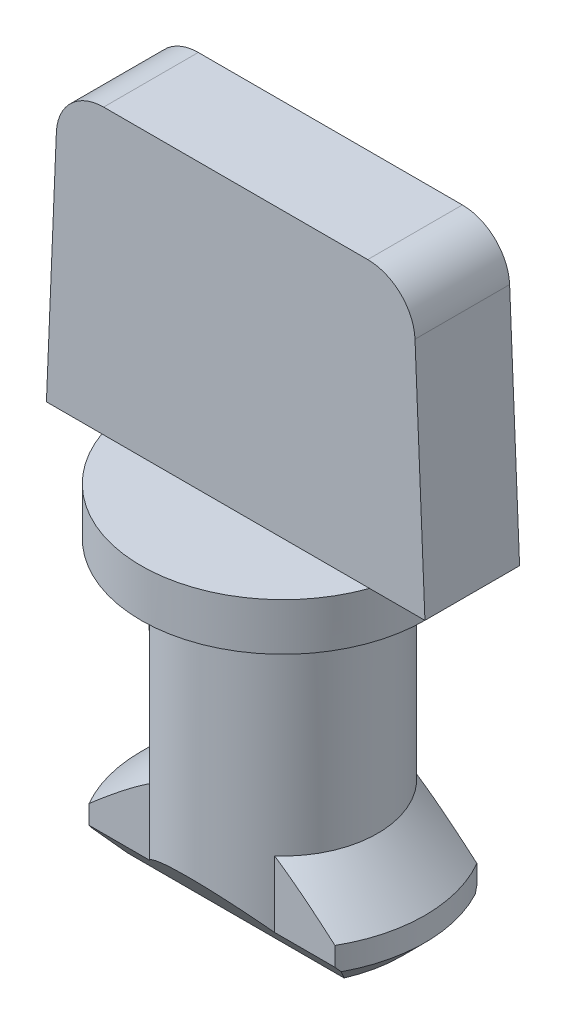
ISO-10303-21;
HEADER;
FILE_DESCRIPTION(('STEP AP214'),'2;1');
FILE_NAME('part.step','',(''),(''),'','','');
FILE_SCHEMA(('AUTOMOTIVE_DESIGN { 1 0 10303 214 1 1 1 1 }'));
ENDSEC;
DATA;
#1=APPLICATION_CONTEXT('core data for automotive mechanical design processes');
#2=APPLICATION_PROTOCOL_DEFINITION('international standard','automotive_design',2000,#1);
#3=PRODUCT_CONTEXT('',#1,'mechanical');
#4=PRODUCT('Part','Part','',(#3));
#5=PRODUCT_RELATED_PRODUCT_CATEGORY('part','',(#4));
#6=PRODUCT_DEFINITION_FORMATION('','',#4);
#7=PRODUCT_DEFINITION_CONTEXT('part definition',#1,'design');
#8=PRODUCT_DEFINITION('design','',#6,#7);
#9=PRODUCT_DEFINITION_SHAPE('','',#8);
#10=(LENGTH_UNIT() NAMED_UNIT(*) SI_UNIT(.MILLI.,.METRE.));
#11=(NAMED_UNIT(*) PLANE_ANGLE_UNIT() SI_UNIT($,.RADIAN.));
#12=(NAMED_UNIT(*) SI_UNIT($,.STERADIAN.) SOLID_ANGLE_UNIT());
#13=UNCERTAINTY_MEASURE_WITH_UNIT(LENGTH_MEASURE(1.E-05),#10,'distance_accuracy_value','');
#14=(GEOMETRIC_REPRESENTATION_CONTEXT(3) GLOBAL_UNCERTAINTY_ASSIGNED_CONTEXT((#13)) GLOBAL_UNIT_ASSIGNED_CONTEXT((#10,
#11,#12)) REPRESENTATION_CONTEXT('',''));
#15=CARTESIAN_POINT('',(0.,0.,0.));
#16=DIRECTION('',(0.,0.,1.));
#17=DIRECTION('',(1.,0.,0.));
#18=AXIS2_PLACEMENT_3D('',#15,#16,#17);
#19=CARTESIAN_POINT('',(0.,-6.4,0.));
#20=DIRECTION('',(0.,1.,0.));
#21=DIRECTION('',(0.,0.,1.));
#22=AXIS2_PLACEMENT_3D('',#19,#20,#21);
#23=CYLINDRICAL_SURFACE('',#22,2.);
#24=CARTESIAN_POINT('',(0.,0.,0.));
#25=DIRECTION('',(0.,1.,0.));
#26=DIRECTION('',(0.,0.,1.));
#27=AXIS2_PLACEMENT_3D('',#24,#25,#26);
#28=CIRCLE('',#27,2.);
#29=CARTESIAN_POINT('',(0.,0.,2.));
#30=VERTEX_POINT('',#29);
#31=EDGE_CURVE('E407',#30,#30,#28,.F.);
#32=ORIENTED_EDGE('',*,*,#31,.T.);
#33=EDGE_LOOP('',(#32));
#34=FACE_BOUND('',#33,.T.);
#35=CARTESIAN_POINT('',(0.,-7.6,0.));
#36=DIRECTION('',(0.,-0.640184399664479,-0.768221279597376));
#37=DIRECTION('',(0.,0.768221279597376,-0.640184399664479));
#38=AXIS2_PLACEMENT_3D('',#35,#36,#37);
#39=ELLIPSE('',#38,3.12409987036266,2.);
#40=CARTESIAN_POINT('',(1.32287565553229,-5.8,-1.5));
#41=VERTEX_POINT('',#40);
#42=CARTESIAN_POINT('',(-1.32287565553229,-5.8,-1.5));
#43=VERTEX_POINT('',#42);
#44=EDGE_CURVE('E54',#41,#43,#39,.F.);
#45=ORIENTED_EDGE('',*,*,#44,.T.);
#46=DIRECTION('',(0.,1.,0.));
#47=VECTOR('',#46,1.);
#48=CARTESIAN_POINT('',(-1.32287565553229,-6.4,-1.5));
#49=LINE('',#48,#47);
#50=CARTESIAN_POINT('',(-1.32287565553229,-4.4,-1.5));
#51=VERTEX_POINT('',#50);
#52=EDGE_CURVE('E344',#43,#51,#49,.T.);
#53=ORIENTED_EDGE('',*,*,#52,.T.);
#54=CARTESIAN_POINT('',(0.,-4.4,0.));
#55=DIRECTION('',(0.,-1.,0.));
#56=DIRECTION('',(0.,0.,-1.));
#57=AXIS2_PLACEMENT_3D('',#54,#55,#56);
#58=CIRCLE('',#57,2.);
#59=CARTESIAN_POINT('',(-1.3228756555323,-4.4,1.5));
#60=VERTEX_POINT('',#59);
#61=EDGE_CURVE('E204',#60,#51,#58,.T.);
#62=ORIENTED_EDGE('',*,*,#61,.F.);
#63=DIRECTION('',(0.,1.,0.));
#64=VECTOR('',#63,1.);
#65=CARTESIAN_POINT('',(-1.3228756555323,-6.4,1.5));
#66=LINE('',#65,#64);
#67=CARTESIAN_POINT('',(-1.3228756555323,-5.8,1.5));
#68=VERTEX_POINT('',#67);
#69=EDGE_CURVE('E346',#60,#68,#66,.F.);
#70=ORIENTED_EDGE('',*,*,#69,.T.);
#71=CARTESIAN_POINT('',(0.,-7.6,0.));
#72=DIRECTION('',(0.,-0.640184399664479,0.768221279597376));
#73=DIRECTION('',(0.,0.768221279597376,0.640184399664479));
#74=AXIS2_PLACEMENT_3D('',#71,#72,#73);
#75=ELLIPSE('',#74,3.12409987036266,2.);
#76=CARTESIAN_POINT('',(1.3228756555323,-5.8,1.5));
#77=VERTEX_POINT('',#76);
#78=EDGE_CURVE('E457',#68,#77,#75,.F.);
#79=ORIENTED_EDGE('',*,*,#78,.T.);
#80=DIRECTION('',(0.,1.,0.));
#81=VECTOR('',#80,1.);
#82=CARTESIAN_POINT('',(1.3228756555323,-6.4,1.5));
#83=LINE('',#82,#81);
#84=CARTESIAN_POINT('',(1.3228756555323,-4.4,1.5));
#85=VERTEX_POINT('',#84);
#86=EDGE_CURVE('E332',#77,#85,#83,.T.);
#87=ORIENTED_EDGE('',*,*,#86,.T.);
#88=CARTESIAN_POINT('',(1.32287565553229,-4.4,-1.5));
#89=VERTEX_POINT('',#88);
#90=EDGE_CURVE('E199',#89,#85,#58,.T.);
#91=ORIENTED_EDGE('',*,*,#90,.F.);
#92=DIRECTION('',(0.,1.,0.));
#93=VECTOR('',#92,1.);
#94=CARTESIAN_POINT('',(1.32287565553229,-6.4,-1.5));
#95=LINE('',#94,#93);
#96=EDGE_CURVE('E319',#89,#41,#95,.F.);
#97=ORIENTED_EDGE('',*,*,#96,.T.);
#98=EDGE_LOOP('',(#45,#53,#62,#70,#79,#87,#91,#97));
#99=FACE_BOUND('',#98,.T.);
#100=ADVANCED_FACE('F34',(#34,#99),#23,.T.);
#101=CARTESIAN_POINT('',(0.,-6.4,0.));
#102=DIRECTION('',(0.,-1.,0.));
#103=DIRECTION('',(0.,0.,-1.));
#104=AXIS2_PLACEMENT_3D('',#101,#102,#103);
#105=PLANE('',#104);
#106=CARTESIAN_POINT('',(0.,-6.4,0.));
#107=DIRECTION('',(0.,-1.,0.));
#108=DIRECTION('',(0.,0.,-1.));
#109=AXIS2_PLACEMENT_3D('',#106,#107,#108);
#110=CIRCLE('',#109,2.5);
#111=CARTESIAN_POINT('',(-2.29128784747792,-6.4,1.));
#112=VERTEX_POINT('',#111);
#113=CARTESIAN_POINT('',(-2.29128784747792,-6.4,-1.));
#114=VERTEX_POINT('',#113);
#115=EDGE_CURVE('E191',#112,#114,#110,.T.);
#116=ORIENTED_EDGE('',*,*,#115,.T.);
#117=DIRECTION('',(-1.,0.,0.));
#118=VECTOR('',#117,1.);
#119=CARTESIAN_POINT('',(4.001,-6.4,-1.));
#120=LINE('',#119,#118);
#121=CARTESIAN_POINT('',(2.29128784747792,-6.4,-1.));
#122=VERTEX_POINT('',#121);
#123=EDGE_CURVE('E175',#122,#114,#120,.T.);
#124=ORIENTED_EDGE('',*,*,#123,.F.);
#125=CARTESIAN_POINT('',(0.,-6.4,0.));
#126=DIRECTION('',(0.,-1.,0.));
#127=DIRECTION('',(0.,0.,-1.));
#128=AXIS2_PLACEMENT_3D('',#125,#126,#127);
#129=CIRCLE('',#128,2.5);
#130=CARTESIAN_POINT('',(2.29128784747792,-6.4,1.));
#131=VERTEX_POINT('',#130);
#132=EDGE_CURVE('E198',#122,#131,#129,.T.);
#133=ORIENTED_EDGE('',*,*,#132,.T.);
#134=DIRECTION('',(-1.,0.,0.));
#135=VECTOR('',#134,1.);
#136=CARTESIAN_POINT('',(4.001,-6.4,1.));
#137=LINE('',#136,#135);
#138=EDGE_CURVE('E197',#131,#112,#137,.T.);
#139=ORIENTED_EDGE('',*,*,#138,.T.);
#140=EDGE_LOOP('',(#116,#124,#133,#139));
#141=FACE_BOUND('',#140,.T.);
#142=ADVANCED_FACE('F195',(#141),#105,.T.);
#143=CARTESIAN_POINT('',(0.,-4.4,0.));
#144=DIRECTION('',(0.,-1.,0.));
#145=DIRECTION('',(0.,0.,-1.));
#146=AXIS2_PLACEMENT_3D('',#143,#144,#145);
#147=CYLINDRICAL_SURFACE('',#146,3.);
#148=DIRECTION('',(0.,-1.,0.));
#149=VECTOR('',#148,1.);
#150=CARTESIAN_POINT('',(-2.59807621135331,-4.4,-1.5));
#151=LINE('',#150,#149);
#152=CARTESIAN_POINT('',(-2.59807621135331,-5.4,-1.5));
#153=VERTEX_POINT('',#152);
#154=CARTESIAN_POINT('',(-2.59807621135331,-5.8,-1.5));
#155=VERTEX_POINT('',#154);
#156=EDGE_CURVE('E327',#153,#155,#151,.T.);
#157=ORIENTED_EDGE('',*,*,#156,.T.);
#158=CARTESIAN_POINT('',(0.,-7.6,0.));
#159=DIRECTION('',(0.,0.640184399664479,0.768221279597376));
#160=DIRECTION('',(0.,-0.768221279597376,0.640184399664479));
#161=AXIS2_PLACEMENT_3D('',#158,#159,#160);
#162=ELLIPSE('',#161,4.68614980554399,3.);
#163=CARTESIAN_POINT('',(-2.6444386087704,-5.9,-1.41666666666667));
#164=VERTEX_POINT('',#163);
#165=EDGE_CURVE('E192',#155,#164,#162,.T.);
#166=ORIENTED_EDGE('',*,*,#165,.T.);
#167=CARTESIAN_POINT('',(0.,-5.9,0.));
#168=DIRECTION('',(0.,-1.,0.));
#169=DIRECTION('',(0.,0.,-1.));
#170=AXIS2_PLACEMENT_3D('',#167,#168,#169);
#171=CIRCLE('',#170,3.);
#172=CARTESIAN_POINT('',(-2.6444386087704,-5.9,1.41666666666667));
#173=VERTEX_POINT('',#172);
#174=EDGE_CURVE('E62',#164,#173,#171,.F.);
#175=ORIENTED_EDGE('',*,*,#174,.T.);
#176=CARTESIAN_POINT('',(0.,-7.6,0.));
#177=DIRECTION('',(0.,0.640184399664479,-0.768221279597376));
#178=DIRECTION('',(0.,-0.768221279597376,-0.640184399664479));
#179=AXIS2_PLACEMENT_3D('',#176,#177,#178);
#180=ELLIPSE('',#179,4.68614980554399,3.);
#181=CARTESIAN_POINT('',(-2.59807621135332,-5.8,1.5));
#182=VERTEX_POINT('',#181);
#183=EDGE_CURVE('E455',#173,#182,#180,.T.);
#184=ORIENTED_EDGE('',*,*,#183,.T.);
#185=DIRECTION('',(0.,-1.,0.));
#186=VECTOR('',#185,1.);
#187=CARTESIAN_POINT('',(-2.59807621135332,-4.4,1.5));
#188=LINE('',#187,#186);
#189=CARTESIAN_POINT('',(-2.59807621135332,-5.4,1.5));
#190=VERTEX_POINT('',#189);
#191=EDGE_CURVE('E335',#190,#182,#188,.T.);
#192=ORIENTED_EDGE('',*,*,#191,.F.);
#193=CARTESIAN_POINT('',(0.,-5.4,0.));
#194=DIRECTION('',(0.,-1.,0.));
#195=DIRECTION('',(0.,0.,-1.));
#196=AXIS2_PLACEMENT_3D('',#193,#194,#195);
#197=CIRCLE('',#196,3.);
#198=EDGE_CURVE('E307',#190,#153,#197,.T.);
#199=ORIENTED_EDGE('',*,*,#198,.T.);
#200=EDGE_LOOP('',(#157,#166,#175,#184,#192,#199));
#201=FACE_BOUND('',#200,.T.);
#202=ADVANCED_FACE('F296',(#201),#147,.T.);
#203=CARTESIAN_POINT('',(0.,-4.4,0.));
#204=DIRECTION('',(0.,-1.,0.));
#205=DIRECTION('',(0.,0.,-1.));
#206=AXIS2_PLACEMENT_3D('',#203,#204,#205);
#207=CYLINDRICAL_SURFACE('',#206,3.);
#208=CARTESIAN_POINT('',(0.,-5.9,0.));
#209=DIRECTION('',(0.,-1.,0.));
#210=DIRECTION('',(0.,0.,-1.));
#211=AXIS2_PLACEMENT_3D('',#208,#209,#210);
#212=CIRCLE('',#211,3.);
#213=CARTESIAN_POINT('',(2.6444386087704,-5.9,1.41666666666667));
#214=VERTEX_POINT('',#213);
#215=CARTESIAN_POINT('',(2.6444386087704,-5.9,-1.41666666666667));
#216=VERTEX_POINT('',#215);
#217=EDGE_CURVE('E201',#214,#216,#212,.F.);
#218=ORIENTED_EDGE('',*,*,#217,.T.);
#219=CARTESIAN_POINT('',(0.,-7.6,0.));
#220=DIRECTION('',(0.,-0.640184399664479,-0.768221279597376));
#221=DIRECTION('',(0.,-0.768221279597376,0.640184399664479));
#222=AXIS2_PLACEMENT_3D('',#219,#220,#221);
#223=ELLIPSE('',#222,4.68614980554399,3.);
#224=CARTESIAN_POINT('',(2.59807621135332,-5.8,-1.5));
#225=VERTEX_POINT('',#224);
#226=EDGE_CURVE('E184',#225,#216,#223,.T.);
#227=ORIENTED_EDGE('',*,*,#226,.F.);
#228=DIRECTION('',(0.,-1.,0.));
#229=VECTOR('',#228,1.);
#230=CARTESIAN_POINT('',(2.59807621135332,-4.4,-1.5));
#231=LINE('',#230,#229);
#232=CARTESIAN_POINT('',(2.59807621135332,-5.4,-1.5));
#233=VERTEX_POINT('',#232);
#234=EDGE_CURVE('E317',#233,#225,#231,.T.);
#235=ORIENTED_EDGE('',*,*,#234,.F.);
#236=CARTESIAN_POINT('',(0.,-5.4,0.));
#237=DIRECTION('',(0.,-1.,0.));
#238=DIRECTION('',(0.,0.,-1.));
#239=AXIS2_PLACEMENT_3D('',#236,#237,#238);
#240=CIRCLE('',#239,3.);
#241=CARTESIAN_POINT('',(2.59807621135331,-5.4,1.5));
#242=VERTEX_POINT('',#241);
#243=EDGE_CURVE('E211',#233,#242,#240,.T.);
#244=ORIENTED_EDGE('',*,*,#243,.T.);
#245=DIRECTION('',(0.,-1.,0.));
#246=VECTOR('',#245,1.);
#247=CARTESIAN_POINT('',(2.59807621135331,-4.4,1.5));
#248=LINE('',#247,#246);
#249=CARTESIAN_POINT('',(2.59807621135331,-5.8,1.5));
#250=VERTEX_POINT('',#249);
#251=EDGE_CURVE('E326',#242,#250,#248,.T.);
#252=ORIENTED_EDGE('',*,*,#251,.T.);
#253=CARTESIAN_POINT('',(0.,-7.6,0.));
#254=DIRECTION('',(0.,-0.640184399664479,0.768221279597376));
#255=DIRECTION('',(0.,-0.768221279597376,-0.640184399664479));
#256=AXIS2_PLACEMENT_3D('',#253,#254,#255);
#257=ELLIPSE('',#256,4.68614980554399,3.);
#258=EDGE_CURVE('E342',#214,#250,#257,.T.);
#259=ORIENTED_EDGE('',*,*,#258,.F.);
#260=EDGE_LOOP('',(#218,#227,#235,#244,#252,#259));
#261=FACE_BOUND('',#260,.T.);
#262=ADVANCED_FACE('F243',(#261),#207,.T.);
#263=CARTESIAN_POINT('',(0.,-6.4,0.));
#264=DIRECTION('',(0.,1.,0.));
#265=DIRECTION('',(0.,0.,1.));
#266=AXIS2_PLACEMENT_3D('',#263,#264,#265);
#267=CONICAL_SURFACE('',#266,2.5,0.785398163397447);
#268=ORIENTED_EDGE('',*,*,#132,.F.);
#269=CARTESIAN_POINT('',(2.64457621284688,-5.8998,-1.41683333333333));
#270=CARTESIAN_POINT('',(2.61571622950897,-5.94174573392667,-1.38187855506111));
#271=CARTESIAN_POINT('',(2.58672640656104,-5.98363888665853,-1.34696759445123));
#272=CARTESIAN_POINT('',(2.52846110996167,-6.06730594817641,-1.27724504318632));
#273=CARTESIAN_POINT('',(2.49918564601116,-6.10907986095021,-1.24243344920815));
#274=CARTESIAN_POINT('',(2.44032091626879,-6.19249752762652,-1.1729187269779));
#275=CARTESIAN_POINT('',(2.41073164802869,-6.23414128051025,-1.13821559957479));
#276=CARTESIAN_POINT('',(2.35120561961057,-6.31728375835709,-1.06893020136909));
#277=CARTESIAN_POINT('',(2.32126884769733,-6.35878247836048,-1.0343479346996));
#278=CARTESIAN_POINT('',(2.29114236693467,-6.40020000000059,-0.999833333332844));
#279=B_SPLINE_CURVE_WITH_KNOTS('',3,(#269,#270,#271,#272,#273,#274,#275,#276,#277,#278),
.UNSPECIFIED.,.F.,.F.,(4,2,2,2,4),(0.,0.185277194335566,0.370548118041205,0.555820488266649,
0.741099133467555),.UNSPECIFIED.);
#280=EDGE_CURVE('E180',#216,#122,#279,.T.);
#281=ORIENTED_EDGE('',*,*,#280,.F.);
#282=ORIENTED_EDGE('',*,*,#217,.F.);
#283=CARTESIAN_POINT('',(2.29114236693309,-6.40019999999994,0.999833333333381));
#284=CARTESIAN_POINT('',(2.32126884769675,-6.35878247836026,1.03434793469978));
#285=CARTESIAN_POINT('',(2.35120561961041,-6.31728375835704,1.06893020136913));
#286=CARTESIAN_POINT('',(2.41073164802883,-6.23414128051033,1.13821559957473));
#287=CARTESIAN_POINT('',(2.44032091626883,-6.19249752762655,1.17291872697788));
#288=CARTESIAN_POINT('',(2.49918564601111,-6.1090798609502,1.24243344920816));
#289=CARTESIAN_POINT('',(2.52846110996164,-6.06730594817641,1.27724504318632));
#290=CARTESIAN_POINT('',(2.58672640656106,-5.98363888665854,1.34696759445122));
#291=CARTESIAN_POINT('',(2.61571622950901,-5.94174573392669,1.38187855506109));
#292=CARTESIAN_POINT('',(2.64457621284688,-5.8998,1.41683333333333));
#293=B_SPLINE_CURVE_WITH_KNOTS('',3,(#283,#284,#285,#286,#287,#288,#289,#290,#291,#292),
.UNSPECIFIED.,.F.,.F.,(4,2,2,2,4),(0.,0.185278645200923,0.370551015426376,0.555821939132017,
0.741099133467591),.UNSPECIFIED.);
#294=EDGE_CURVE('E459',#131,#214,#293,.T.);
#295=ORIENTED_EDGE('',*,*,#294,.F.);
#296=EDGE_LOOP('',(#268,#281,#282,#295));
#297=FACE_BOUND('',#296,.T.);
#298=ADVANCED_FACE('F240',(#297),#267,.T.);
#299=CARTESIAN_POINT('',(0.,-6.4,0.));
#300=DIRECTION('',(0.,1.,0.));
#301=DIRECTION('',(0.,0.,1.));
#302=AXIS2_PLACEMENT_3D('',#299,#300,#301);
#303=CONICAL_SURFACE('',#302,2.5,0.785398163397447);
#304=ORIENTED_EDGE('',*,*,#174,.F.);
#305=CARTESIAN_POINT('',(-2.64457621284688,-5.8998,-1.41683333333333));
#306=CARTESIAN_POINT('',(-2.61571622950897,-5.94174573392667,-1.38187855506111));
#307=CARTESIAN_POINT('',(-2.58672640656104,-5.98363888665854,-1.34696759445122));
#308=CARTESIAN_POINT('',(-2.52846110996165,-6.06730594817643,-1.27724504318631));
#309=CARTESIAN_POINT('',(-2.49918564601114,-6.10907986095024,-1.24243344920813));
#310=CARTESIAN_POINT('',(-2.44032091626877,-6.19249752762655,-1.17291872697787));
#311=CARTESIAN_POINT('',(-2.41073164802866,-6.23414128051029,-1.13821559957476));
#312=CARTESIAN_POINT('',(-2.35120561961054,-6.31728375835714,-1.06893020136905));
#313=CARTESIAN_POINT('',(-2.32126884769729,-6.35878247836053,-1.03434793469956));
#314=CARTESIAN_POINT('',(-2.29114236693463,-6.40020000000064,-0.999833333332797));
#315=B_SPLINE_CURVE_WITH_KNOTS('',3,(#305,#306,#307,#308,#309,#310,#311,#312,#313,#314),
.UNSPECIFIED.,.F.,.F.,(4,2,2,2,4),(0.,0.185277194335587,0.370548118041249,0.555820488266713,
0.74109913346764),.UNSPECIFIED.);
#316=EDGE_CURVE('E178',#164,#114,#315,.T.);
#317=ORIENTED_EDGE('',*,*,#316,.T.);
#318=ORIENTED_EDGE('',*,*,#115,.F.);
#319=CARTESIAN_POINT('',(-2.29114236693304,-6.4002,0.999833333333334));
#320=CARTESIAN_POINT('',(-2.32126884769671,-6.35878247836031,1.03434793469974));
#321=CARTESIAN_POINT('',(-2.35120561961037,-6.31728375835709,1.0689302013691));
#322=CARTESIAN_POINT('',(-2.4107316480288,-6.23414128051037,1.13821559957469));
#323=CARTESIAN_POINT('',(-2.44032091626881,-6.19249752762658,1.17291872697785));
#324=CARTESIAN_POINT('',(-2.49918564601109,-6.10907986095023,1.24243344920814));
#325=CARTESIAN_POINT('',(-2.52846110996163,-6.06730594817643,1.27724504318631));
#326=CARTESIAN_POINT('',(-2.58672640656106,-5.98363888665855,1.34696759445121));
#327=CARTESIAN_POINT('',(-2.61571622950901,-5.94174573392669,1.38187855506109));
#328=CARTESIAN_POINT('',(-2.64457621284688,-5.8998,1.41683333333333));
#329=B_SPLINE_CURVE_WITH_KNOTS('',3,(#319,#320,#321,#322,#323,#324,#325,#326,#327,#328),
.UNSPECIFIED.,.F.,.F.,(4,2,2,2,4),(0.,0.185278645200944,0.370551015426419,0.555821939132081,
0.741099133467676),.UNSPECIFIED.);
#330=EDGE_CURVE('E446',#112,#173,#329,.T.);
#331=ORIENTED_EDGE('',*,*,#330,.T.);
#332=EDGE_LOOP('',(#304,#317,#318,#331));
#333=FACE_BOUND('',#332,.T.);
#334=ADVANCED_FACE('F189',(#333),#303,.T.);
#335=CARTESIAN_POINT('',(-2.59807621135331,-4.4,-1.5));
#336=DIRECTION('',(0.,0.,-1.));
#337=DIRECTION('',(-1.,0.,0.));
#338=AXIS2_PLACEMENT_3D('',#335,#336,#337);
#339=PLANE('',#338);
#340=ORIENTED_EDGE('',*,*,#52,.F.);
#341=DIRECTION('',(-1.,0.,0.));
#342=VECTOR('',#341,1.);
#343=CARTESIAN_POINT('',(-4.001,-5.8,-1.5));
#344=LINE('',#343,#342);
#345=EDGE_CURVE('E418',#43,#155,#344,.T.);
#346=ORIENTED_EDGE('',*,*,#345,.T.);
#347=ORIENTED_EDGE('',*,*,#156,.F.);
#348=CARTESIAN_POINT('',(-2.59807621135331,-5.4,-1.5));
#349=CARTESIAN_POINT('',(-2.54699202981894,-5.35576185939409,-1.5));
#350=CARTESIAN_POINT('',(-2.49574934324268,-5.31170762331325,-1.5));
#351=CARTESIAN_POINT('',(-2.39288833200145,-5.22403804046788,-1.5));
#352=CARTESIAN_POINT('',(-2.3412699999935,-5.18042270232268,-1.5));
#353=CARTESIAN_POINT('',(-2.18586566547732,-5.05042711859945,-1.5));
#354=CARTESIAN_POINT('',(-2.081432912337,-4.96481248213767,-1.5));
#355=CARTESIAN_POINT('',(-1.92296734799839,-4.83860460277783,-1.5));
#356=CARTESIAN_POINT('',(-1.86982608787186,-4.79689180204332,-1.5));
#357=CARTESIAN_POINT('',(-1.76283273605452,-4.71439359904855,-1.5));
#358=CARTESIAN_POINT('',(-1.70898069254342,-4.67360813443487,-1.5));
#359=CARTESIAN_POINT('',(-1.60037667643987,-4.59314081533693,-1.5));
#360=CARTESIAN_POINT('',(-1.54562391618775,-4.55346001850828,-1.5));
#361=CARTESIAN_POINT('',(-1.43507460370071,-4.4755544852038,-1.5));
#362=CARTESIAN_POINT('',(-1.37927780634971,-4.43733009722093,-1.5));
#363=CARTESIAN_POINT('',(-1.32287565553229,-4.4,-1.5));
#364=B_SPLINE_CURVE_WITH_KNOTS('',3,(#348,#349,#350,#351,#352,#353,#354,#355,#356,#357,#358,
#359,#360,#361,#362,#363),.UNSPECIFIED.,.F.,.F.,(4,2,2,2,2,2,2,4),(0.,0.202728019806967,
0.405460013167092,0.810536547966821,1.01319983446231,1.21584945347921,1.41868685322817,
1.6215724874218),.UNSPECIFIED.);
#365=EDGE_CURVE('E47',#153,#51,#364,.T.);
#366=ORIENTED_EDGE('',*,*,#365,.T.);
#367=EDGE_LOOP('',(#340,#346,#347,#366));
#368=FACE_BOUND('',#367,.T.);
#369=ADVANCED_FACE('F239',(#368),#339,.T.);
#370=ORIENTED_EDGE('',*,*,#234,.T.);
#371=DIRECTION('',(1.,0.,0.));
#372=VECTOR('',#371,1.);
#373=CARTESIAN_POINT('',(4.001,-5.8,-1.5));
#374=LINE('',#373,#372);
#375=EDGE_CURVE('E185',#41,#225,#374,.T.);
#376=ORIENTED_EDGE('',*,*,#375,.F.);
#377=ORIENTED_EDGE('',*,*,#96,.F.);
#378=CARTESIAN_POINT('',(1.32287565553229,-4.4,-1.5));
#379=CARTESIAN_POINT('',(1.37927780634971,-4.43733009722093,-1.5));
#380=CARTESIAN_POINT('',(1.43507460370071,-4.4755544852038,-1.5));
#381=CARTESIAN_POINT('',(1.54562391618775,-4.55346001850828,-1.5));
#382=CARTESIAN_POINT('',(1.60037667643987,-4.59314081533693,-1.5));
#383=CARTESIAN_POINT('',(1.70898069254342,-4.67360813443487,-1.5));
#384=CARTESIAN_POINT('',(1.76283273605452,-4.71439359904855,-1.5));
#385=CARTESIAN_POINT('',(1.86982608787186,-4.79689180204332,-1.5));
#386=CARTESIAN_POINT('',(1.92296734799839,-4.83860460277783,-1.5));
#387=CARTESIAN_POINT('',(2.081432912337,-4.96481248213767,-1.5));
#388=CARTESIAN_POINT('',(2.18586566547732,-5.05042711859945,-1.5));
#389=CARTESIAN_POINT('',(2.3412699999935,-5.18042270232268,-1.5));
#390=CARTESIAN_POINT('',(2.39288833200145,-5.22403804046788,-1.5));
#391=CARTESIAN_POINT('',(2.49574934324268,-5.31170762331325,-1.5));
#392=CARTESIAN_POINT('',(2.54699202981894,-5.35576185939409,-1.5));
#393=CARTESIAN_POINT('',(2.59807621135332,-5.4,-1.5));
#394=B_SPLINE_CURVE_WITH_KNOTS('',3,(#378,#379,#380,#381,#382,#383,#384,#385,#386,#387,#388,
#389,#390,#391,#392,#393),.UNSPECIFIED.,.F.,.F.,(4,2,2,2,2,2,2,4),(0.,0.202885634193624,
0.405723033942589,0.608372652959487,0.811035939454977,1.2161124742547,1.41884446761483,
1.6215724874218),.UNSPECIFIED.);
#395=EDGE_CURVE('E220',#89,#233,#394,.T.);
#396=ORIENTED_EDGE('',*,*,#395,.T.);
#397=EDGE_LOOP('',(#370,#376,#377,#396));
#398=FACE_BOUND('',#397,.T.);
#399=ADVANCED_FACE('F300',(#398),#339,.T.);
#400=CARTESIAN_POINT('',(-2.59807621135332,-4.4,1.5));
#401=DIRECTION('',(0.,0.,1.));
#402=DIRECTION('',(1.,0.,0.));
#403=AXIS2_PLACEMENT_3D('',#400,#401,#402);
#404=PLANE('',#403);
#405=ORIENTED_EDGE('',*,*,#191,.T.);
#406=DIRECTION('',(1.,0.,0.));
#407=VECTOR('',#406,1.);
#408=CARTESIAN_POINT('',(-4.001,-5.8,1.5));
#409=LINE('',#408,#407);
#410=EDGE_CURVE('E452',#182,#68,#409,.T.);
#411=ORIENTED_EDGE('',*,*,#410,.T.);
#412=ORIENTED_EDGE('',*,*,#69,.F.);
#413=CARTESIAN_POINT('',(-1.32287565553229,-4.4,1.5));
#414=CARTESIAN_POINT('',(-1.37927780634971,-4.43733009722093,1.5));
#415=CARTESIAN_POINT('',(-1.43507460370071,-4.4755544852038,1.5));
#416=CARTESIAN_POINT('',(-1.54562391618775,-4.55346001850828,1.5));
#417=CARTESIAN_POINT('',(-1.60037667643988,-4.59314081533693,1.5));
#418=CARTESIAN_POINT('',(-1.70898069254342,-4.67360813443487,1.5));
#419=CARTESIAN_POINT('',(-1.76283273605452,-4.71439359904855,1.5));
#420=CARTESIAN_POINT('',(-1.86982608787186,-4.79689180204332,1.5));
#421=CARTESIAN_POINT('',(-1.92296734799839,-4.83860460277784,1.5));
#422=CARTESIAN_POINT('',(-2.081432912337,-4.96481248213767,1.5));
#423=CARTESIAN_POINT('',(-2.18586566547732,-5.05042711859945,1.5));
#424=CARTESIAN_POINT('',(-2.3412699999935,-5.18042270232268,1.5));
#425=CARTESIAN_POINT('',(-2.39288833200145,-5.22403804046788,1.5));
#426=CARTESIAN_POINT('',(-2.49574934324268,-5.31170762331325,1.5));
#427=CARTESIAN_POINT('',(-2.54699202981894,-5.35576185939409,1.5));
#428=CARTESIAN_POINT('',(-2.59807621135332,-5.4,1.5));
#429=B_SPLINE_CURVE_WITH_KNOTS('',3,(#413,#414,#415,#416,#417,#418,#419,#420,#421,#422,#423,
#424,#425,#426,#427,#428),.UNSPECIFIED.,.F.,.F.,(4,2,2,2,2,2,2,4),(0.,0.202885634193625,
0.405723033942589,0.608372652959488,0.811035939454976,1.2161124742547,1.41884446761483,
1.6215724874218),.UNSPECIFIED.);
#430=EDGE_CURVE('E11',#60,#190,#429,.T.);
#431=ORIENTED_EDGE('',*,*,#430,.T.);
#432=EDGE_LOOP('',(#405,#411,#412,#431));
#433=FACE_BOUND('',#432,.T.);
#434=ADVANCED_FACE('F226',(#433),#404,.T.);
#435=ORIENTED_EDGE('',*,*,#86,.F.);
#436=DIRECTION('',(-1.,0.,0.));
#437=VECTOR('',#436,1.);
#438=CARTESIAN_POINT('',(4.001,-5.8,1.5));
#439=LINE('',#438,#437);
#440=EDGE_CURVE('E333',#250,#77,#439,.T.);
#441=ORIENTED_EDGE('',*,*,#440,.F.);
#442=ORIENTED_EDGE('',*,*,#251,.F.);
#443=CARTESIAN_POINT('',(2.59807621135331,-5.4,1.5));
#444=CARTESIAN_POINT('',(2.54699202981894,-5.35576185939409,1.5));
#445=CARTESIAN_POINT('',(2.49574934324268,-5.31170762331325,1.5));
#446=CARTESIAN_POINT('',(2.39288833200145,-5.22403804046788,1.5));
#447=CARTESIAN_POINT('',(2.3412699999935,-5.18042270232268,1.5));
#448=CARTESIAN_POINT('',(2.18586566547732,-5.05042711859945,1.5));
#449=CARTESIAN_POINT('',(2.081432912337,-4.96481248213767,1.5));
#450=CARTESIAN_POINT('',(1.92296734799839,-4.83860460277783,1.5));
#451=CARTESIAN_POINT('',(1.86982608787186,-4.79689180204332,1.5));
#452=CARTESIAN_POINT('',(1.76283273605452,-4.71439359904855,1.5));
#453=CARTESIAN_POINT('',(1.70898069254342,-4.67360813443487,1.5));
#454=CARTESIAN_POINT('',(1.60037667643987,-4.59314081533693,1.5));
#455=CARTESIAN_POINT('',(1.54562391618775,-4.55346001850828,1.5));
#456=CARTESIAN_POINT('',(1.43507460370071,-4.4755544852038,1.5));
#457=CARTESIAN_POINT('',(1.37927780634971,-4.43733009722093,1.5));
#458=CARTESIAN_POINT('',(1.32287565553229,-4.4,1.5));
#459=B_SPLINE_CURVE_WITH_KNOTS('',3,(#443,#444,#445,#446,#447,#448,#449,#450,#451,#452,#453,
#454,#455,#456,#457,#458),.UNSPECIFIED.,.F.,.F.,(4,2,2,2,2,2,2,4),(0.,0.202728019806967,
0.405460013167093,0.81053654796682,1.01319983446231,1.21584945347921,1.41868685322817,
1.6215724874218),.UNSPECIFIED.);
#460=EDGE_CURVE('E214',#242,#85,#459,.T.);
#461=ORIENTED_EDGE('',*,*,#460,.T.);
#462=EDGE_LOOP('',(#435,#441,#442,#461));
#463=FACE_BOUND('',#462,.T.);
#464=ADVANCED_FACE('F262',(#463),#404,.T.);
#465=CARTESIAN_POINT('',(0.,0.,0.));
#466=DIRECTION('',(0.,1.,0.));
#467=DIRECTION('',(0.,0.,1.));
#468=AXIS2_PLACEMENT_3D('',#465,#466,#467);
#469=PLANE('',#468);
#470=CARTESIAN_POINT('',(0.,0.,0.));
#471=DIRECTION('',(0.,1.,0.));
#472=DIRECTION('',(0.,0.,1.));
#473=AXIS2_PLACEMENT_3D('',#470,#471,#472);
#474=CIRCLE('',#473,3.);
#475=CARTESIAN_POINT('',(0.,0.,3.));
#476=VERTEX_POINT('',#475);
#477=EDGE_CURVE('E380',#476,#476,#474,.T.);
#478=ORIENTED_EDGE('',*,*,#477,.F.);
#479=EDGE_LOOP('',(#478));
#480=FACE_BOUND('',#479,.T.);
#481=ORIENTED_EDGE('',*,*,#31,.F.);
#482=EDGE_LOOP('',(#481));
#483=FACE_BOUND('',#482,.T.);
#484=ADVANCED_FACE('F259',(#480,#483),#469,.F.);
#485=CARTESIAN_POINT('',(0.,1.,0.));
#486=DIRECTION('',(0.,1.,0.));
#487=DIRECTION('',(0.,0.,1.));
#488=AXIS2_PLACEMENT_3D('',#485,#486,#487);
#489=PLANE('',#488);
#490=CARTESIAN_POINT('',(0.,1.,0.));
#491=DIRECTION('',(0.,1.,0.));
#492=DIRECTION('',(0.,0.,1.));
#493=AXIS2_PLACEMENT_3D('',#490,#491,#492);
#494=CIRCLE('',#493,3.);
#495=CARTESIAN_POINT('',(2.82842712474619,1.,-1.));
#496=VERTEX_POINT('',#495);
#497=CARTESIAN_POINT('',(-2.82842712474619,1.,-1.));
#498=VERTEX_POINT('',#497);
#499=EDGE_CURVE('E386',#496,#498,#494,.T.);
#500=ORIENTED_EDGE('',*,*,#499,.T.);
#501=DIRECTION('',(1.,0.,0.));
#502=VECTOR('',#501,1.);
#503=CARTESIAN_POINT('',(-4.,1.,-1.));
#504=LINE('',#503,#502);
#505=EDGE_CURVE('E370',#498,#496,#504,.T.);
#506=ORIENTED_EDGE('',*,*,#505,.T.);
#507=EDGE_LOOP('',(#500,#506));
#508=FACE_BOUND('',#507,.T.);
#509=ADVANCED_FACE('F257',(#508),#489,.T.);
#510=CARTESIAN_POINT('',(0.,1.,0.));
#511=DIRECTION('',(0.,-1.,0.));
#512=DIRECTION('',(0.,0.,-1.));
#513=AXIS2_PLACEMENT_3D('',#510,#511,#512);
#514=CYLINDRICAL_SURFACE('',#513,3.);
#515=CARTESIAN_POINT('',(2.82842712474619,1.,1.));
#516=VERTEX_POINT('',#515);
#517=EDGE_CURVE('E383',#516,#496,#494,.T.);
#518=ORIENTED_EDGE('',*,*,#517,.F.);
#519=CARTESIAN_POINT('',(-2.82842712474619,1.,1.));
#520=VERTEX_POINT('',#519);
#521=EDGE_CURVE('E387',#520,#516,#494,.T.);
#522=ORIENTED_EDGE('',*,*,#521,.F.);
#523=EDGE_CURVE('E616',#498,#520,#494,.T.);
#524=ORIENTED_EDGE('',*,*,#523,.F.);
#525=ORIENTED_EDGE('',*,*,#499,.F.);
#526=EDGE_LOOP('',(#518,#522,#524,#525));
#527=FACE_BOUND('',#526,.T.);
#528=ORIENTED_EDGE('',*,*,#477,.T.);
#529=EDGE_LOOP('',(#528));
#530=FACE_BOUND('',#529,.T.);
#531=ADVANCED_FACE('F253',(#527,#530),#514,.T.);
#532=DIRECTION('',(1.,0.,0.));
#533=VECTOR('',#532,1.);
#534=CARTESIAN_POINT('',(-4.,1.,1.));
#535=LINE('',#534,#533);
#536=EDGE_CURVE('E357',#520,#516,#535,.T.);
#537=ORIENTED_EDGE('',*,*,#536,.F.);
#538=ORIENTED_EDGE('',*,*,#521,.T.);
#539=EDGE_LOOP('',(#537,#538));
#540=FACE_BOUND('',#539,.T.);
#541=ADVANCED_FACE('F256',(#540),#489,.T.);
#542=CARTESIAN_POINT('',(-4.,1.,-1.));
#543=DIRECTION('',(0.,-1.,0.));
#544=DIRECTION('',(0.,0.,-1.));
#545=AXIS2_PLACEMENT_3D('',#542,#543,#544);
#546=PLANE('',#545);
#547=CARTESIAN_POINT('',(4.,1.,1.));
#548=VERTEX_POINT('',#547);
#549=EDGE_CURVE('E352',#516,#548,#535,.T.);
#550=ORIENTED_EDGE('',*,*,#549,.F.);
#551=ORIENTED_EDGE('',*,*,#517,.T.);
#552=CARTESIAN_POINT('',(4.,1.,-1.));
#553=VERTEX_POINT('',#552);
#554=EDGE_CURVE('E365',#496,#553,#504,.T.);
#555=ORIENTED_EDGE('',*,*,#554,.T.);
#556=DIRECTION('',(0.,0.,1.));
#557=VECTOR('',#556,1.);
#558=CARTESIAN_POINT('',(4.,1.,-1.));
#559=LINE('',#558,#557);
#560=EDGE_CURVE('E377',#553,#548,#559,.T.);
#561=ORIENTED_EDGE('',*,*,#560,.T.);
#562=EDGE_LOOP('',(#550,#551,#555,#561));
#563=FACE_BOUND('',#562,.T.);
#564=ADVANCED_FACE('F266',(#563),#546,.T.);
#565=CARTESIAN_POINT('',(-3.75,7.,-1.));
#566=DIRECTION('',(-0.999133073092352,0.0416305447121814,0.));
#567=DIRECTION('',(-0.0416305447121814,-0.999133073092352,0.));
#568=AXIS2_PLACEMENT_3D('',#565,#566,#567);
#569=PLANE('',#568);
#570=DIRECTION('',(-0.0416305447121814,-0.999133073092352,0.));
#571=VECTOR('',#570,1.);
#572=CARTESIAN_POINT('',(-3.75,7.,1.));
#573=LINE('',#572,#571);
#574=CARTESIAN_POINT('',(-3.78993206063699,6.04163054471218,1.));
#575=VERTEX_POINT('',#574);
#576=CARTESIAN_POINT('',(-4.,1.,1.));
#577=VERTEX_POINT('',#576);
#578=EDGE_CURVE('E350',#575,#577,#573,.T.);
#579=ORIENTED_EDGE('',*,*,#578,.F.);
#580=DIRECTION('',(0.,0.,1.));
#581=VECTOR('',#580,1.);
#582=CARTESIAN_POINT('',(-3.78993206063699,6.04163054471218,-1.));
#583=LINE('',#582,#581);
#584=CARTESIAN_POINT('',(-3.78993206063699,6.04163054471218,-1.));
#585=VERTEX_POINT('',#584);
#586=EDGE_CURVE('E399',#575,#585,#583,.F.);
#587=ORIENTED_EDGE('',*,*,#586,.T.);
#588=DIRECTION('',(-0.0416305447121814,-0.999133073092352,0.));
#589=VECTOR('',#588,1.);
#590=CARTESIAN_POINT('',(-3.75,7.,-1.));
#591=LINE('',#590,#589);
#592=CARTESIAN_POINT('',(-4.,1.,-1.));
#593=VERTEX_POINT('',#592);
#594=EDGE_CURVE('E363',#585,#593,#591,.T.);
#595=ORIENTED_EDGE('',*,*,#594,.T.);
#596=DIRECTION('',(0.,0.,1.));
#597=VECTOR('',#596,1.);
#598=CARTESIAN_POINT('',(-4.,1.,-1.));
#599=LINE('',#598,#597);
#600=EDGE_CURVE('E376',#593,#577,#599,.T.);
#601=ORIENTED_EDGE('',*,*,#600,.T.);
#602=EDGE_LOOP('',(#579,#587,#595,#601));
#603=FACE_BOUND('',#602,.T.);
#604=ADVANCED_FACE('F268',(#603),#569,.T.);
#605=CARTESIAN_POINT('',(-3.75,7.,-1.));
#606=DIRECTION('',(0.,1.,0.));
#607=DIRECTION('',(0.,0.,1.));
#608=AXIS2_PLACEMENT_3D('',#605,#606,#607);
#609=PLANE('',#608);
#610=DIRECTION('',(-1.,0.,0.));
#611=VECTOR('',#610,1.);
#612=CARTESIAN_POINT('',(-3.75,7.,-1.));
#613=LINE('',#612,#611);
#614=CARTESIAN_POINT('',(2.79079898754464,7.,-1.));
#615=VERTEX_POINT('',#614);
#616=CARTESIAN_POINT('',(-2.79079898754464,7.,-1.));
#617=VERTEX_POINT('',#616);
#618=EDGE_CURVE('E373',#615,#617,#613,.T.);
#619=ORIENTED_EDGE('',*,*,#618,.T.);
#620=DIRECTION('',(0.,0.,1.));
#621=VECTOR('',#620,1.);
#622=CARTESIAN_POINT('',(-2.79079898754464,7.,-1.));
#623=LINE('',#622,#621);
#624=CARTESIAN_POINT('',(-2.79079898754464,7.,1.));
#625=VERTEX_POINT('',#624);
#626=EDGE_CURVE('E392',#617,#625,#623,.T.);
#627=ORIENTED_EDGE('',*,*,#626,.T.);
#628=DIRECTION('',(-1.,0.,0.));
#629=VECTOR('',#628,1.);
#630=CARTESIAN_POINT('',(-3.75,7.,1.));
#631=LINE('',#630,#629);
#632=CARTESIAN_POINT('',(2.79079898754464,7.,1.));
#633=VERTEX_POINT('',#632);
#634=EDGE_CURVE('E360',#633,#625,#631,.T.);
#635=ORIENTED_EDGE('',*,*,#634,.F.);
#636=DIRECTION('',(0.,0.,1.));
#637=VECTOR('',#636,1.);
#638=CARTESIAN_POINT('',(2.79079898754464,7.,-1.));
#639=LINE('',#638,#637);
#640=EDGE_CURVE('E390',#633,#615,#639,.F.);
#641=ORIENTED_EDGE('',*,*,#640,.T.);
#642=EDGE_LOOP('',(#619,#627,#635,#641));
#643=FACE_BOUND('',#642,.T.);
#644=ADVANCED_FACE('F271',(#643),#609,.T.);
#645=CARTESIAN_POINT('',(3.75,7.,-1.));
#646=DIRECTION('',(0.999133073092352,0.0416305447121814,0.));
#647=DIRECTION('',(-0.0416305447121814,0.999133073092352,0.));
#648=AXIS2_PLACEMENT_3D('',#645,#646,#647);
#649=PLANE('',#648);
#650=DIRECTION('',(-0.0416305447121814,0.999133073092352,0.));
#651=VECTOR('',#650,1.);
#652=CARTESIAN_POINT('',(3.75,7.,-1.));
#653=LINE('',#652,#651);
#654=CARTESIAN_POINT('',(3.78993206063699,6.04163054471218,-1.));
#655=VERTEX_POINT('',#654);
#656=EDGE_CURVE('E369',#553,#655,#653,.T.);
#657=ORIENTED_EDGE('',*,*,#656,.T.);
#658=DIRECTION('',(0.,0.,1.));
#659=VECTOR('',#658,1.);
#660=CARTESIAN_POINT('',(3.78993206063699,6.04163054471218,-1.));
#661=LINE('',#660,#659);
#662=CARTESIAN_POINT('',(3.78993206063699,6.04163054471218,1.));
#663=VERTEX_POINT('',#662);
#664=EDGE_CURVE('E405',#655,#663,#661,.T.);
#665=ORIENTED_EDGE('',*,*,#664,.T.);
#666=DIRECTION('',(-0.0416305447121814,0.999133073092352,0.));
#667=VECTOR('',#666,1.);
#668=CARTESIAN_POINT('',(3.75,7.,1.));
#669=LINE('',#668,#667);
#670=EDGE_CURVE('E356',#548,#663,#669,.T.);
#671=ORIENTED_EDGE('',*,*,#670,.F.);
#672=ORIENTED_EDGE('',*,*,#560,.F.);
#673=EDGE_LOOP('',(#657,#665,#671,#672));
#674=FACE_BOUND('',#673,.T.);
#675=ADVANCED_FACE('F277',(#674),#649,.T.);
#676=EDGE_CURVE('E366',#593,#498,#504,.T.);
#677=ORIENTED_EDGE('',*,*,#676,.T.);
#678=ORIENTED_EDGE('',*,*,#523,.T.);
#679=EDGE_CURVE('E353',#577,#520,#535,.T.);
#680=ORIENTED_EDGE('',*,*,#679,.F.);
#681=ORIENTED_EDGE('',*,*,#600,.F.);
#682=EDGE_LOOP('',(#677,#678,#680,#681));
#683=FACE_BOUND('',#682,.T.);
#684=ADVANCED_FACE('F273',(#683),#546,.T.);
#685=CARTESIAN_POINT('',(0.,0.,-1.));
#686=DIRECTION('',(0.,0.,1.));
#687=DIRECTION('',(1.,0.,0.));
#688=AXIS2_PLACEMENT_3D('',#685,#686,#687);
#689=PLANE('',#688);
#690=ORIENTED_EDGE('',*,*,#594,.F.);
#691=CARTESIAN_POINT('',(-2.79079898754464,6.,-1.));
#692=DIRECTION('',(0.,0.,1.));
#693=DIRECTION('',(1.,0.,0.));
#694=AXIS2_PLACEMENT_3D('',#691,#692,#693);
#695=CIRCLE('',#694,1.);
#696=EDGE_CURVE('E403',#585,#617,#695,.F.);
#697=ORIENTED_EDGE('',*,*,#696,.T.);
#698=ORIENTED_EDGE('',*,*,#618,.F.);
#699=CARTESIAN_POINT('',(2.79079898754464,6.,-1.));
#700=DIRECTION('',(0.,0.,1.));
#701=DIRECTION('',(1.,0.,0.));
#702=AXIS2_PLACEMENT_3D('',#699,#700,#701);
#703=CIRCLE('',#702,1.);
#704=EDGE_CURVE('E401',#615,#655,#703,.F.);
#705=ORIENTED_EDGE('',*,*,#704,.T.);
#706=ORIENTED_EDGE('',*,*,#656,.F.);
#707=ORIENTED_EDGE('',*,*,#554,.F.);
#708=ORIENTED_EDGE('',*,*,#505,.F.);
#709=ORIENTED_EDGE('',*,*,#676,.F.);
#710=EDGE_LOOP('',(#690,#697,#698,#705,#706,#707,#708,#709));
#711=FACE_BOUND('',#710,.T.);
#712=ADVANCED_FACE('F276',(#711),#689,.F.);
#713=CARTESIAN_POINT('',(0.,0.,1.));
#714=DIRECTION('',(0.,0.,1.));
#715=DIRECTION('',(1.,0.,0.));
#716=AXIS2_PLACEMENT_3D('',#713,#714,#715);
#717=PLANE('',#716);
#718=ORIENTED_EDGE('',*,*,#634,.T.);
#719=CARTESIAN_POINT('',(-2.79079898754464,6.,1.));
#720=DIRECTION('',(0.,0.,1.));
#721=DIRECTION('',(1.,0.,0.));
#722=AXIS2_PLACEMENT_3D('',#719,#720,#721);
#723=CIRCLE('',#722,1.);
#724=EDGE_CURVE('E397',#625,#575,#723,.T.);
#725=ORIENTED_EDGE('',*,*,#724,.T.);
#726=ORIENTED_EDGE('',*,*,#578,.T.);
#727=ORIENTED_EDGE('',*,*,#679,.T.);
#728=ORIENTED_EDGE('',*,*,#536,.T.);
#729=ORIENTED_EDGE('',*,*,#549,.T.);
#730=ORIENTED_EDGE('',*,*,#670,.T.);
#731=CARTESIAN_POINT('',(2.79079898754464,6.,1.));
#732=DIRECTION('',(0.,0.,1.));
#733=DIRECTION('',(1.,0.,0.));
#734=AXIS2_PLACEMENT_3D('',#731,#732,#733);
#735=CIRCLE('',#734,1.);
#736=EDGE_CURVE('E395',#663,#633,#735,.T.);
#737=ORIENTED_EDGE('',*,*,#736,.T.);
#738=EDGE_LOOP('',(#718,#725,#726,#727,#728,#729,#730,#737));
#739=FACE_BOUND('',#738,.T.);
#740=ADVANCED_FACE('F251',(#739),#717,.T.);
#741=CARTESIAN_POINT('',(-2.79079898754464,6.,-1.));
#742=DIRECTION('',(0.,0.,1.));
#743=DIRECTION('',(1.,0.,0.));
#744=AXIS2_PLACEMENT_3D('',#741,#742,#743);
#745=CYLINDRICAL_SURFACE('',#744,1.);
#746=ORIENTED_EDGE('',*,*,#696,.F.);
#747=ORIENTED_EDGE('',*,*,#586,.F.);
#748=ORIENTED_EDGE('',*,*,#724,.F.);
#749=ORIENTED_EDGE('',*,*,#626,.F.);
#750=EDGE_LOOP('',(#746,#747,#748,#749));
#751=FACE_BOUND('',#750,.T.);
#752=ADVANCED_FACE('F247',(#751),#745,.T.);
#753=CARTESIAN_POINT('',(2.79079898754464,6.,-1.));
#754=DIRECTION('',(0.,0.,1.));
#755=DIRECTION('',(1.,0.,0.));
#756=AXIS2_PLACEMENT_3D('',#753,#754,#755);
#757=CYLINDRICAL_SURFACE('',#756,1.);
#758=ORIENTED_EDGE('',*,*,#704,.F.);
#759=ORIENTED_EDGE('',*,*,#640,.F.);
#760=ORIENTED_EDGE('',*,*,#736,.F.);
#761=ORIENTED_EDGE('',*,*,#664,.F.);
#762=EDGE_LOOP('',(#758,#759,#760,#761));
#763=FACE_BOUND('',#762,.T.);
#764=ADVANCED_FACE('F234',(#763),#757,.T.);
#765=CARTESIAN_POINT('',(0.,-5.4,0.));
#766=DIRECTION('',(0.,-1.,0.));
#767=DIRECTION('',(0.,0.,-1.));
#768=AXIS2_PLACEMENT_3D('',#765,#766,#767);
#769=CONICAL_SURFACE('',#768,3.,0.78539816339745);
#770=ORIENTED_EDGE('',*,*,#395,.F.);
#771=ORIENTED_EDGE('',*,*,#90,.T.);
#772=ORIENTED_EDGE('',*,*,#460,.F.);
#773=ORIENTED_EDGE('',*,*,#243,.F.);
#774=EDGE_LOOP('',(#770,#771,#772,#773));
#775=FACE_BOUND('',#774,.T.);
#776=ADVANCED_FACE('F230',(#775),#769,.T.);
#777=CARTESIAN_POINT('',(0.,-5.4,0.));
#778=DIRECTION('',(0.,-1.,0.));
#779=DIRECTION('',(0.,0.,-1.));
#780=AXIS2_PLACEMENT_3D('',#777,#778,#779);
#781=CONICAL_SURFACE('',#780,3.,0.78539816339745);
#782=ORIENTED_EDGE('',*,*,#430,.F.);
#783=ORIENTED_EDGE('',*,*,#61,.T.);
#784=ORIENTED_EDGE('',*,*,#365,.F.);
#785=ORIENTED_EDGE('',*,*,#198,.F.);
#786=EDGE_LOOP('',(#782,#783,#784,#785));
#787=FACE_BOUND('',#786,.T.);
#788=ADVANCED_FACE('F36',(#787),#781,.T.);
#789=CARTESIAN_POINT('',(4.001,-5.2,2.));
#790=DIRECTION('',(0.,-0.640184399664479,0.768221279597376));
#791=DIRECTION('',(0.,-0.768221279597376,-0.640184399664479));
#792=AXIS2_PLACEMENT_3D('',#789,#790,#791);
#793=PLANE('',#792);
#794=ORIENTED_EDGE('',*,*,#138,.F.);
#795=ORIENTED_EDGE('',*,*,#294,.T.);
#796=ORIENTED_EDGE('',*,*,#258,.T.);
#797=ORIENTED_EDGE('',*,*,#440,.T.);
#798=ORIENTED_EDGE('',*,*,#78,.F.);
#799=ORIENTED_EDGE('',*,*,#410,.F.);
#800=ORIENTED_EDGE('',*,*,#183,.F.);
#801=ORIENTED_EDGE('',*,*,#330,.F.);
#802=EDGE_LOOP('',(#794,#795,#796,#797,#798,#799,#800,#801));
#803=FACE_BOUND('',#802,.T.);
#804=ADVANCED_FACE('F440',(#803),#793,.T.);
#805=CARTESIAN_POINT('',(4.001,-5.2,-2.));
#806=DIRECTION('',(0.,-0.640184399664479,-0.768221279597376));
#807=DIRECTION('',(0.,0.768221279597376,-0.640184399664479));
#808=AXIS2_PLACEMENT_3D('',#805,#806,#807);
#809=PLANE('',#808);
#810=ORIENTED_EDGE('',*,*,#375,.T.);
#811=ORIENTED_EDGE('',*,*,#226,.T.);
#812=ORIENTED_EDGE('',*,*,#280,.T.);
#813=ORIENTED_EDGE('',*,*,#123,.T.);
#814=ORIENTED_EDGE('',*,*,#316,.F.);
#815=ORIENTED_EDGE('',*,*,#165,.F.);
#816=ORIENTED_EDGE('',*,*,#345,.F.);
#817=ORIENTED_EDGE('',*,*,#44,.F.);
#818=EDGE_LOOP('',(#810,#811,#812,#813,#814,#815,#816,#817));
#819=FACE_BOUND('',#818,.T.);
#820=ADVANCED_FACE('F177',(#819),#809,.T.);
#821=CLOSED_SHELL('',(#100,#142,#202,#262,#298,#334,#369,#399,#434,#464,#484,#509,#531,#541,
#564,#604,#644,#675,#684,#712,#740,#752,#764,#776,#788,#804,#820));
#822=MANIFOLD_SOLID_BREP('B2',#821);
#823=ADVANCED_BREP_SHAPE_REPRESENTATION('',(#18,#822),#14);
#824=SHAPE_DEFINITION_REPRESENTATION(#9,#823);
ENDSEC;
END-ISO-10303-21;
